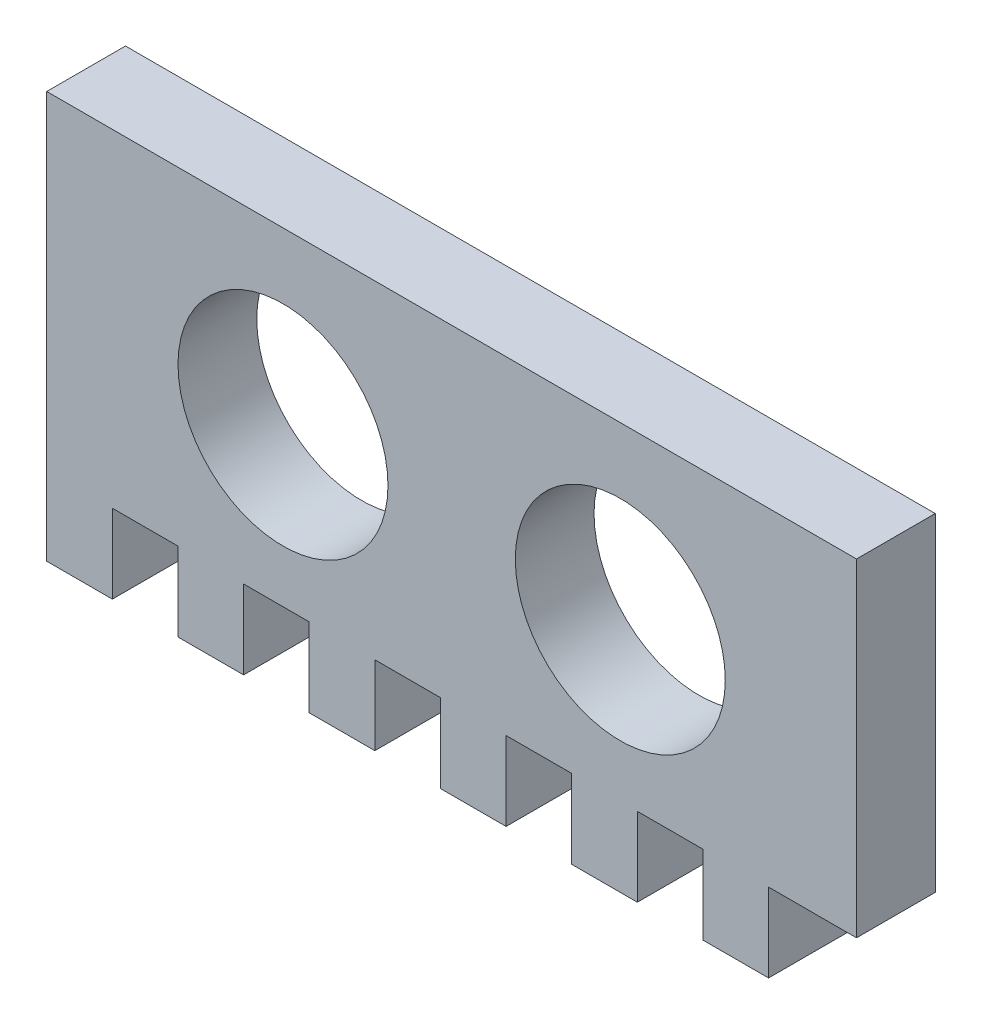
ISO-10303-21;
HEADER;
FILE_DESCRIPTION(('STEP AP214'),'2;1');
FILE_NAME('part.step','',(''),(''),'','','');
FILE_SCHEMA(('AUTOMOTIVE_DESIGN { 1 0 10303 214 1 1 1 1 }'));
ENDSEC;
DATA;
#1=APPLICATION_CONTEXT('core data for automotive mechanical design processes');
#2=APPLICATION_PROTOCOL_DEFINITION('international standard','automotive_design',2000,#1);
#3=PRODUCT_CONTEXT('',#1,'mechanical');
#4=PRODUCT('Part','Part','',(#3));
#5=PRODUCT_RELATED_PRODUCT_CATEGORY('part','',(#4));
#6=PRODUCT_DEFINITION_FORMATION('','',#4);
#7=PRODUCT_DEFINITION_CONTEXT('part definition',#1,'design');
#8=PRODUCT_DEFINITION('design','',#6,#7);
#9=PRODUCT_DEFINITION_SHAPE('','',#8);
#10=(LENGTH_UNIT() NAMED_UNIT(*) SI_UNIT(.MILLI.,.METRE.));
#11=(NAMED_UNIT(*) PLANE_ANGLE_UNIT() SI_UNIT($,.RADIAN.));
#12=(NAMED_UNIT(*) SI_UNIT($,.STERADIAN.) SOLID_ANGLE_UNIT());
#13=UNCERTAINTY_MEASURE_WITH_UNIT(LENGTH_MEASURE(1.E-05),#10,'distance_accuracy_value','');
#14=(GEOMETRIC_REPRESENTATION_CONTEXT(3) GLOBAL_UNCERTAINTY_ASSIGNED_CONTEXT((#13)) GLOBAL_UNIT_ASSIGNED_CONTEXT((#10,
#11,#12)) REPRESENTATION_CONTEXT('',''));
#15=CARTESIAN_POINT('',(0.,0.,0.));
#16=DIRECTION('',(0.,0.,1.));
#17=DIRECTION('',(1.,0.,0.));
#18=AXIS2_PLACEMENT_3D('',#15,#16,#17);
#19=CARTESIAN_POINT('',(0.,0.,6.));
#20=DIRECTION('',(0.,0.,1.));
#21=DIRECTION('',(1.,0.,0.));
#22=AXIS2_PLACEMENT_3D('',#19,#20,#21);
#23=PLANE('',#22);
#24=CARTESIAN_POINT('',(18.,18.,6.));
#25=DIRECTION('',(0.,0.,1.));
#26=DIRECTION('',(1.,0.,0.));
#27=AXIS2_PLACEMENT_3D('',#24,#25,#26);
#28=CIRCLE('',#27,8.);
#29=CARTESIAN_POINT('',(26.,18.,6.));
#30=VERTEX_POINT('',#29);
#31=EDGE_CURVE('E370',#30,#30,#28,.T.);
#32=ORIENTED_EDGE('',*,*,#31,.F.);
#33=EDGE_LOOP('',(#32));
#34=FACE_BOUND('',#33,.T.);
#35=DIRECTION('',(1.,0.,0.));
#36=VECTOR('',#35,1.);
#37=CARTESIAN_POINT('',(0.,0.,6.));
#38=LINE('',#37,#36);
#39=CARTESIAN_POINT('',(0.,0.,6.));
#40=VERTEX_POINT('',#39);
#41=CARTESIAN_POINT('',(5.,0.,6.));
#42=VERTEX_POINT('',#41);
#43=EDGE_CURVE('E363',#40,#42,#38,.T.);
#44=ORIENTED_EDGE('',*,*,#43,.T.);
#45=DIRECTION('',(0.,1.,0.));
#46=VECTOR('',#45,1.);
#47=CARTESIAN_POINT('',(5.,0.,6.));
#48=LINE('',#47,#46);
#49=CARTESIAN_POINT('',(5.,6.,6.));
#50=VERTEX_POINT('',#49);
#51=EDGE_CURVE('E159',#42,#50,#48,.T.);
#52=ORIENTED_EDGE('',*,*,#51,.T.);
#53=DIRECTION('',(1.,0.,0.));
#54=VECTOR('',#53,1.);
#55=CARTESIAN_POINT('',(5.,6.,6.));
#56=LINE('',#55,#54);
#57=CARTESIAN_POINT('',(10.,6.,6.));
#58=VERTEX_POINT('',#57);
#59=EDGE_CURVE('E357',#50,#58,#56,.T.);
#60=ORIENTED_EDGE('',*,*,#59,.T.);
#61=DIRECTION('',(0.,-1.,0.));
#62=VECTOR('',#61,1.);
#63=CARTESIAN_POINT('',(10.,6.,6.));
#64=LINE('',#63,#62);
#65=CARTESIAN_POINT('',(10.,0.,6.));
#66=VERTEX_POINT('',#65);
#67=EDGE_CURVE('E349',#58,#66,#64,.T.);
#68=ORIENTED_EDGE('',*,*,#67,.T.);
#69=DIRECTION('',(1.,0.,0.));
#70=VECTOR('',#69,1.);
#71=CARTESIAN_POINT('',(10.,0.,6.));
#72=LINE('',#71,#70);
#73=CARTESIAN_POINT('',(15.,0.,6.));
#74=VERTEX_POINT('',#73);
#75=EDGE_CURVE('E345',#66,#74,#72,.T.);
#76=ORIENTED_EDGE('',*,*,#75,.T.);
#77=DIRECTION('',(0.,1.,0.));
#78=VECTOR('',#77,1.);
#79=CARTESIAN_POINT('',(15.,0.,6.));
#80=LINE('',#79,#78);
#81=CARTESIAN_POINT('',(15.,6.,6.));
#82=VERTEX_POINT('',#81);
#83=EDGE_CURVE('E341',#74,#82,#80,.T.);
#84=ORIENTED_EDGE('',*,*,#83,.T.);
#85=DIRECTION('',(1.,0.,0.));
#86=VECTOR('',#85,1.);
#87=CARTESIAN_POINT('',(15.,6.,6.));
#88=LINE('',#87,#86);
#89=CARTESIAN_POINT('',(20.,6.,6.));
#90=VERTEX_POINT('',#89);
#91=EDGE_CURVE('E338',#82,#90,#88,.T.);
#92=ORIENTED_EDGE('',*,*,#91,.T.);
#93=DIRECTION('',(0.,-1.,0.));
#94=VECTOR('',#93,1.);
#95=CARTESIAN_POINT('',(20.,6.,6.));
#96=LINE('',#95,#94);
#97=CARTESIAN_POINT('',(20.,0.,6.));
#98=VERTEX_POINT('',#97);
#99=EDGE_CURVE('E330',#90,#98,#96,.T.);
#100=ORIENTED_EDGE('',*,*,#99,.T.);
#101=DIRECTION('',(1.,0.,0.));
#102=VECTOR('',#101,1.);
#103=CARTESIAN_POINT('',(20.,0.,6.));
#104=LINE('',#103,#102);
#105=CARTESIAN_POINT('',(25.,0.,6.));
#106=VERTEX_POINT('',#105);
#107=EDGE_CURVE('E326',#98,#106,#104,.T.);
#108=ORIENTED_EDGE('',*,*,#107,.T.);
#109=DIRECTION('',(0.,1.,0.));
#110=VECTOR('',#109,1.);
#111=CARTESIAN_POINT('',(25.,0.,6.));
#112=LINE('',#111,#110);
#113=CARTESIAN_POINT('',(25.,6.,6.));
#114=VERTEX_POINT('',#113);
#115=EDGE_CURVE('E322',#106,#114,#112,.T.);
#116=ORIENTED_EDGE('',*,*,#115,.T.);
#117=DIRECTION('',(1.,0.,0.));
#118=VECTOR('',#117,1.);
#119=CARTESIAN_POINT('',(25.,6.,6.));
#120=LINE('',#119,#118);
#121=CARTESIAN_POINT('',(30.,6.,6.));
#122=VERTEX_POINT('',#121);
#123=EDGE_CURVE('E319',#114,#122,#120,.T.);
#124=ORIENTED_EDGE('',*,*,#123,.T.);
#125=DIRECTION('',(0.,-1.,0.));
#126=VECTOR('',#125,1.);
#127=CARTESIAN_POINT('',(30.,6.,6.));
#128=LINE('',#127,#126);
#129=CARTESIAN_POINT('',(30.,0.,6.));
#130=VERTEX_POINT('',#129);
#131=EDGE_CURVE('E311',#122,#130,#128,.T.);
#132=ORIENTED_EDGE('',*,*,#131,.T.);
#133=DIRECTION('',(1.,0.,0.));
#134=VECTOR('',#133,1.);
#135=CARTESIAN_POINT('',(30.,0.,6.));
#136=LINE('',#135,#134);
#137=CARTESIAN_POINT('',(35.,0.,6.));
#138=VERTEX_POINT('',#137);
#139=EDGE_CURVE('E307',#130,#138,#136,.T.);
#140=ORIENTED_EDGE('',*,*,#139,.T.);
#141=DIRECTION('',(0.,1.,0.));
#142=VECTOR('',#141,1.);
#143=CARTESIAN_POINT('',(35.,0.,6.));
#144=LINE('',#143,#142);
#145=CARTESIAN_POINT('',(35.,6.,6.));
#146=VERTEX_POINT('',#145);
#147=EDGE_CURVE('E303',#138,#146,#144,.T.);
#148=ORIENTED_EDGE('',*,*,#147,.T.);
#149=DIRECTION('',(1.,0.,0.));
#150=VECTOR('',#149,1.);
#151=CARTESIAN_POINT('',(35.,6.,6.));
#152=LINE('',#151,#150);
#153=CARTESIAN_POINT('',(40.,6.,6.));
#154=VERTEX_POINT('',#153);
#155=EDGE_CURVE('E300',#146,#154,#152,.T.);
#156=ORIENTED_EDGE('',*,*,#155,.T.);
#157=DIRECTION('',(0.,-1.,0.));
#158=VECTOR('',#157,1.);
#159=CARTESIAN_POINT('',(40.,6.,6.));
#160=LINE('',#159,#158);
#161=CARTESIAN_POINT('',(40.,0.,6.));
#162=VERTEX_POINT('',#161);
#163=EDGE_CURVE('E292',#154,#162,#160,.T.);
#164=ORIENTED_EDGE('',*,*,#163,.T.);
#165=DIRECTION('',(1.,0.,0.));
#166=VECTOR('',#165,1.);
#167=CARTESIAN_POINT('',(40.,0.,6.));
#168=LINE('',#167,#166);
#169=CARTESIAN_POINT('',(45.,0.,6.));
#170=VERTEX_POINT('',#169);
#171=EDGE_CURVE('E288',#162,#170,#168,.T.);
#172=ORIENTED_EDGE('',*,*,#171,.T.);
#173=DIRECTION('',(0.,1.,0.));
#174=VECTOR('',#173,1.);
#175=CARTESIAN_POINT('',(45.,0.,6.));
#176=LINE('',#175,#174);
#177=CARTESIAN_POINT('',(45.,6.,6.));
#178=VERTEX_POINT('',#177);
#179=EDGE_CURVE('E284',#170,#178,#176,.T.);
#180=ORIENTED_EDGE('',*,*,#179,.T.);
#181=DIRECTION('',(1.,0.,0.));
#182=VECTOR('',#181,1.);
#183=CARTESIAN_POINT('',(45.,6.,6.));
#184=LINE('',#183,#182);
#185=CARTESIAN_POINT('',(50.,6.,6.));
#186=VERTEX_POINT('',#185);
#187=EDGE_CURVE('E281',#178,#186,#184,.T.);
#188=ORIENTED_EDGE('',*,*,#187,.T.);
#189=DIRECTION('',(0.,-1.,0.));
#190=VECTOR('',#189,1.);
#191=CARTESIAN_POINT('',(50.,6.,6.));
#192=LINE('',#191,#190);
#193=CARTESIAN_POINT('',(50.,0.,6.));
#194=VERTEX_POINT('',#193);
#195=EDGE_CURVE('E273',#186,#194,#192,.T.);
#196=ORIENTED_EDGE('',*,*,#195,.T.);
#197=DIRECTION('',(1.,0.,0.));
#198=VECTOR('',#197,1.);
#199=CARTESIAN_POINT('',(50.,0.,6.));
#200=LINE('',#199,#198);
#201=CARTESIAN_POINT('',(55.,0.,6.));
#202=VERTEX_POINT('',#201);
#203=EDGE_CURVE('E269',#194,#202,#200,.T.);
#204=ORIENTED_EDGE('',*,*,#203,.T.);
#205=DIRECTION('',(0.,1.,0.));
#206=VECTOR('',#205,1.);
#207=CARTESIAN_POINT('',(55.,0.,6.));
#208=LINE('',#207,#206);
#209=CARTESIAN_POINT('',(55.,6.,6.));
#210=VERTEX_POINT('',#209);
#211=EDGE_CURVE('E265',#202,#210,#208,.T.);
#212=ORIENTED_EDGE('',*,*,#211,.T.);
#213=DIRECTION('',(1.,0.,0.));
#214=VECTOR('',#213,1.);
#215=CARTESIAN_POINT('',(55.,6.,6.));
#216=LINE('',#215,#214);
#217=CARTESIAN_POINT('',(61.7,6.,6.));
#218=VERTEX_POINT('',#217);
#219=EDGE_CURVE('E232',#210,#218,#216,.T.);
#220=ORIENTED_EDGE('',*,*,#219,.T.);
#221=DIRECTION('',(0.,1.,0.));
#222=VECTOR('',#221,1.);
#223=CARTESIAN_POINT('',(61.7,31.,6.));
#224=LINE('',#223,#222);
#225=CARTESIAN_POINT('',(61.7,31.,6.));
#226=VERTEX_POINT('',#225);
#227=EDGE_CURVE('E226',#218,#226,#224,.T.);
#228=ORIENTED_EDGE('',*,*,#227,.T.);
#229=DIRECTION('',(-1.,0.,0.));
#230=VECTOR('',#229,1.);
#231=CARTESIAN_POINT('',(0.,31.,6.));
#232=LINE('',#231,#230);
#233=CARTESIAN_POINT('',(0.,31.,6.));
#234=VERTEX_POINT('',#233);
#235=EDGE_CURVE('E230',#226,#234,#232,.T.);
#236=ORIENTED_EDGE('',*,*,#235,.T.);
#237=DIRECTION('',(0.,-1.,0.));
#238=VECTOR('',#237,1.);
#239=CARTESIAN_POINT('',(0.,0.,6.));
#240=LINE('',#239,#238);
#241=EDGE_CURVE('E62',#234,#40,#240,.T.);
#242=ORIENTED_EDGE('',*,*,#241,.T.);
#243=EDGE_LOOP('',(#44,#52,#60,#68,#76,#84,#92,#100,#108,#116,#124,#132,#140,#148,#156,#164,
#172,#180,#188,#196,#204,#212,#220,#228,#236,#242));
#244=FACE_BOUND('',#243,.T.);
#245=CARTESIAN_POINT('',(43.7,18.,6.));
#246=DIRECTION('',(0.,0.,1.));
#247=DIRECTION('',(1.,0.,0.));
#248=AXIS2_PLACEMENT_3D('',#245,#246,#247);
#249=CIRCLE('',#248,8.);
#250=CARTESIAN_POINT('',(51.7,18.,6.));
#251=VERTEX_POINT('',#250);
#252=EDGE_CURVE('E379',#251,#251,#249,.T.);
#253=ORIENTED_EDGE('',*,*,#252,.F.);
#254=EDGE_LOOP('',(#253));
#255=FACE_BOUND('',#254,.T.);
#256=ADVANCED_FACE('F44',(#34,#244,#255),#23,.T.);
#257=CARTESIAN_POINT('',(0.,0.,0.));
#258=DIRECTION('',(0.,0.,1.));
#259=DIRECTION('',(1.,0.,0.));
#260=AXIS2_PLACEMENT_3D('',#257,#258,#259);
#261=PLANE('',#260);
#262=DIRECTION('',(1.,0.,0.));
#263=VECTOR('',#262,1.);
#264=CARTESIAN_POINT('',(0.,0.,0.));
#265=LINE('',#264,#263);
#266=CARTESIAN_POINT('',(0.,0.,0.));
#267=VERTEX_POINT('',#266);
#268=CARTESIAN_POINT('',(5.,0.,0.));
#269=VERTEX_POINT('',#268);
#270=EDGE_CURVE('E375',#267,#269,#265,.T.);
#271=ORIENTED_EDGE('',*,*,#270,.F.);
#272=DIRECTION('',(0.,-1.,0.));
#273=VECTOR('',#272,1.);
#274=CARTESIAN_POINT('',(0.,0.,0.));
#275=LINE('',#274,#273);
#276=CARTESIAN_POINT('',(0.,31.,0.));
#277=VERTEX_POINT('',#276);
#278=EDGE_CURVE('E151',#277,#267,#275,.T.);
#279=ORIENTED_EDGE('',*,*,#278,.F.);
#280=DIRECTION('',(-1.,0.,0.));
#281=VECTOR('',#280,1.);
#282=CARTESIAN_POINT('',(0.,31.,0.));
#283=LINE('',#282,#281);
#284=CARTESIAN_POINT('',(61.7,31.,0.));
#285=VERTEX_POINT('',#284);
#286=EDGE_CURVE('E145',#285,#277,#283,.T.);
#287=ORIENTED_EDGE('',*,*,#286,.F.);
#288=DIRECTION('',(0.,1.,0.));
#289=VECTOR('',#288,1.);
#290=CARTESIAN_POINT('',(61.7,31.,0.));
#291=LINE('',#290,#289);
#292=CARTESIAN_POINT('',(61.7,6.,0.));
#293=VERTEX_POINT('',#292);
#294=EDGE_CURVE('E241',#293,#285,#291,.T.);
#295=ORIENTED_EDGE('',*,*,#294,.F.);
#296=DIRECTION('',(1.,0.,0.));
#297=VECTOR('',#296,1.);
#298=CARTESIAN_POINT('',(55.,6.,0.));
#299=LINE('',#298,#297);
#300=CARTESIAN_POINT('',(55.,6.,0.));
#301=VERTEX_POINT('',#300);
#302=EDGE_CURVE('E583',#301,#293,#299,.T.);
#303=ORIENTED_EDGE('',*,*,#302,.F.);
#304=DIRECTION('',(0.,1.,0.));
#305=VECTOR('',#304,1.);
#306=CARTESIAN_POINT('',(55.,0.,0.));
#307=LINE('',#306,#305);
#308=CARTESIAN_POINT('',(55.,0.,0.));
#309=VERTEX_POINT('',#308);
#310=EDGE_CURVE('E580',#309,#301,#307,.T.);
#311=ORIENTED_EDGE('',*,*,#310,.F.);
#312=DIRECTION('',(1.,0.,0.));
#313=VECTOR('',#312,1.);
#314=CARTESIAN_POINT('',(50.,0.,0.));
#315=LINE('',#314,#313);
#316=CARTESIAN_POINT('',(50.,0.,0.));
#317=VERTEX_POINT('',#316);
#318=EDGE_CURVE('E577',#317,#309,#315,.T.);
#319=ORIENTED_EDGE('',*,*,#318,.F.);
#320=DIRECTION('',(0.,-1.,0.));
#321=VECTOR('',#320,1.);
#322=CARTESIAN_POINT('',(50.,6.,0.));
#323=LINE('',#322,#321);
#324=CARTESIAN_POINT('',(50.,6.,0.));
#325=VERTEX_POINT('',#324);
#326=EDGE_CURVE('E574',#325,#317,#323,.T.);
#327=ORIENTED_EDGE('',*,*,#326,.F.);
#328=DIRECTION('',(1.,0.,0.));
#329=VECTOR('',#328,1.);
#330=CARTESIAN_POINT('',(45.,6.,0.));
#331=LINE('',#330,#329);
#332=CARTESIAN_POINT('',(45.,6.,0.));
#333=VERTEX_POINT('',#332);
#334=EDGE_CURVE('E571',#333,#325,#331,.T.);
#335=ORIENTED_EDGE('',*,*,#334,.F.);
#336=DIRECTION('',(0.,1.,0.));
#337=VECTOR('',#336,1.);
#338=CARTESIAN_POINT('',(45.,0.,0.));
#339=LINE('',#338,#337);
#340=CARTESIAN_POINT('',(45.,0.,0.));
#341=VERTEX_POINT('',#340);
#342=EDGE_CURVE('E568',#341,#333,#339,.T.);
#343=ORIENTED_EDGE('',*,*,#342,.F.);
#344=DIRECTION('',(1.,0.,0.));
#345=VECTOR('',#344,1.);
#346=CARTESIAN_POINT('',(40.,0.,0.));
#347=LINE('',#346,#345);
#348=CARTESIAN_POINT('',(40.,0.,0.));
#349=VERTEX_POINT('',#348);
#350=EDGE_CURVE('E565',#349,#341,#347,.T.);
#351=ORIENTED_EDGE('',*,*,#350,.F.);
#352=DIRECTION('',(0.,-1.,0.));
#353=VECTOR('',#352,1.);
#354=CARTESIAN_POINT('',(40.,6.,0.));
#355=LINE('',#354,#353);
#356=CARTESIAN_POINT('',(40.,6.,0.));
#357=VERTEX_POINT('',#356);
#358=EDGE_CURVE('E562',#357,#349,#355,.T.);
#359=ORIENTED_EDGE('',*,*,#358,.F.);
#360=DIRECTION('',(1.,0.,0.));
#361=VECTOR('',#360,1.);
#362=CARTESIAN_POINT('',(35.,6.,0.));
#363=LINE('',#362,#361);
#364=CARTESIAN_POINT('',(35.,6.,0.));
#365=VERTEX_POINT('',#364);
#366=EDGE_CURVE('E559',#365,#357,#363,.T.);
#367=ORIENTED_EDGE('',*,*,#366,.F.);
#368=DIRECTION('',(0.,1.,0.));
#369=VECTOR('',#368,1.);
#370=CARTESIAN_POINT('',(35.,0.,0.));
#371=LINE('',#370,#369);
#372=CARTESIAN_POINT('',(35.,0.,0.));
#373=VERTEX_POINT('',#372);
#374=EDGE_CURVE('E556',#373,#365,#371,.T.);
#375=ORIENTED_EDGE('',*,*,#374,.F.);
#376=DIRECTION('',(1.,0.,0.));
#377=VECTOR('',#376,1.);
#378=CARTESIAN_POINT('',(30.,0.,0.));
#379=LINE('',#378,#377);
#380=CARTESIAN_POINT('',(30.,0.,0.));
#381=VERTEX_POINT('',#380);
#382=EDGE_CURVE('E553',#381,#373,#379,.T.);
#383=ORIENTED_EDGE('',*,*,#382,.F.);
#384=DIRECTION('',(0.,-1.,0.));
#385=VECTOR('',#384,1.);
#386=CARTESIAN_POINT('',(30.,6.,0.));
#387=LINE('',#386,#385);
#388=CARTESIAN_POINT('',(30.,6.,0.));
#389=VERTEX_POINT('',#388);
#390=EDGE_CURVE('E550',#389,#381,#387,.T.);
#391=ORIENTED_EDGE('',*,*,#390,.F.);
#392=DIRECTION('',(1.,0.,0.));
#393=VECTOR('',#392,1.);
#394=CARTESIAN_POINT('',(25.,6.,0.));
#395=LINE('',#394,#393);
#396=CARTESIAN_POINT('',(25.,6.,0.));
#397=VERTEX_POINT('',#396);
#398=EDGE_CURVE('E547',#397,#389,#395,.T.);
#399=ORIENTED_EDGE('',*,*,#398,.F.);
#400=DIRECTION('',(0.,1.,0.));
#401=VECTOR('',#400,1.);
#402=CARTESIAN_POINT('',(25.,0.,0.));
#403=LINE('',#402,#401);
#404=CARTESIAN_POINT('',(25.,0.,0.));
#405=VERTEX_POINT('',#404);
#406=EDGE_CURVE('E544',#405,#397,#403,.T.);
#407=ORIENTED_EDGE('',*,*,#406,.F.);
#408=DIRECTION('',(1.,0.,0.));
#409=VECTOR('',#408,1.);
#410=CARTESIAN_POINT('',(20.,0.,0.));
#411=LINE('',#410,#409);
#412=CARTESIAN_POINT('',(20.,0.,0.));
#413=VERTEX_POINT('',#412);
#414=EDGE_CURVE('E541',#413,#405,#411,.T.);
#415=ORIENTED_EDGE('',*,*,#414,.F.);
#416=DIRECTION('',(0.,-1.,0.));
#417=VECTOR('',#416,1.);
#418=CARTESIAN_POINT('',(20.,6.,0.));
#419=LINE('',#418,#417);
#420=CARTESIAN_POINT('',(20.,6.,0.));
#421=VERTEX_POINT('',#420);
#422=EDGE_CURVE('E538',#421,#413,#419,.T.);
#423=ORIENTED_EDGE('',*,*,#422,.F.);
#424=DIRECTION('',(1.,0.,0.));
#425=VECTOR('',#424,1.);
#426=CARTESIAN_POINT('',(15.,6.,0.));
#427=LINE('',#426,#425);
#428=CARTESIAN_POINT('',(15.,6.,0.));
#429=VERTEX_POINT('',#428);
#430=EDGE_CURVE('E535',#429,#421,#427,.T.);
#431=ORIENTED_EDGE('',*,*,#430,.F.);
#432=DIRECTION('',(0.,1.,0.));
#433=VECTOR('',#432,1.);
#434=CARTESIAN_POINT('',(15.,0.,0.));
#435=LINE('',#434,#433);
#436=CARTESIAN_POINT('',(15.,0.,0.));
#437=VERTEX_POINT('',#436);
#438=EDGE_CURVE('E532',#437,#429,#435,.T.);
#439=ORIENTED_EDGE('',*,*,#438,.F.);
#440=DIRECTION('',(1.,0.,0.));
#441=VECTOR('',#440,1.);
#442=CARTESIAN_POINT('',(10.,0.,0.));
#443=LINE('',#442,#441);
#444=CARTESIAN_POINT('',(10.,0.,0.));
#445=VERTEX_POINT('',#444);
#446=EDGE_CURVE('E527',#445,#437,#443,.T.);
#447=ORIENTED_EDGE('',*,*,#446,.F.);
#448=DIRECTION('',(0.,-1.,0.));
#449=VECTOR('',#448,1.);
#450=CARTESIAN_POINT('',(10.,6.,0.));
#451=LINE('',#450,#449);
#452=CARTESIAN_POINT('',(10.,6.,0.));
#453=VERTEX_POINT('',#452);
#454=EDGE_CURVE('E523',#453,#445,#451,.T.);
#455=ORIENTED_EDGE('',*,*,#454,.F.);
#456=DIRECTION('',(1.,0.,0.));
#457=VECTOR('',#456,1.);
#458=CARTESIAN_POINT('',(5.,6.,0.));
#459=LINE('',#458,#457);
#460=CARTESIAN_POINT('',(5.,6.,0.));
#461=VERTEX_POINT('',#460);
#462=EDGE_CURVE('E515',#461,#453,#459,.T.);
#463=ORIENTED_EDGE('',*,*,#462,.F.);
#464=DIRECTION('',(0.,1.,0.));
#465=VECTOR('',#464,1.);
#466=CARTESIAN_POINT('',(5.,0.,0.));
#467=LINE('',#466,#465);
#468=EDGE_CURVE('E507',#269,#461,#467,.T.);
#469=ORIENTED_EDGE('',*,*,#468,.F.);
#470=EDGE_LOOP('',(#271,#279,#287,#295,#303,#311,#319,#327,#335,#343,#351,#359,#367,#375,#383,
#391,#399,#407,#415,#423,#431,#439,#447,#455,#463,#469));
#471=FACE_BOUND('',#470,.T.);
#472=CARTESIAN_POINT('',(18.,18.,0.));
#473=DIRECTION('',(0.,0.,1.));
#474=DIRECTION('',(1.,0.,0.));
#475=AXIS2_PLACEMENT_3D('',#472,#473,#474);
#476=CIRCLE('',#475,8.);
#477=CARTESIAN_POINT('',(26.,18.,0.));
#478=VERTEX_POINT('',#477);
#479=EDGE_CURVE('E367',#478,#478,#476,.T.);
#480=ORIENTED_EDGE('',*,*,#479,.T.);
#481=EDGE_LOOP('',(#480));
#482=FACE_BOUND('',#481,.T.);
#483=CARTESIAN_POINT('',(43.7,18.,0.));
#484=DIRECTION('',(0.,0.,1.));
#485=DIRECTION('',(1.,0.,0.));
#486=AXIS2_PLACEMENT_3D('',#483,#484,#485);
#487=CIRCLE('',#486,8.);
#488=CARTESIAN_POINT('',(51.7,18.,0.));
#489=VERTEX_POINT('',#488);
#490=EDGE_CURVE('E376',#489,#489,#487,.T.);
#491=ORIENTED_EDGE('',*,*,#490,.T.);
#492=EDGE_LOOP('',(#491));
#493=FACE_BOUND('',#492,.T.);
#494=ADVANCED_FACE('F389',(#471,#482,#493),#261,.F.);
#495=CARTESIAN_POINT('',(0.,0.,6.));
#496=DIRECTION('',(0.,1.,0.));
#497=DIRECTION('',(0.,0.,1.));
#498=AXIS2_PLACEMENT_3D('',#495,#496,#497);
#499=PLANE('',#498);
#500=ORIENTED_EDGE('',*,*,#270,.T.);
#501=DIRECTION('',(0.,0.,-1.));
#502=VECTOR('',#501,1.);
#503=CARTESIAN_POINT('',(5.,0.,6.));
#504=LINE('',#503,#502);
#505=EDGE_CURVE('E12',#42,#269,#504,.T.);
#506=ORIENTED_EDGE('',*,*,#505,.F.);
#507=ORIENTED_EDGE('',*,*,#43,.F.);
#508=DIRECTION('',(0.,0.,-1.));
#509=VECTOR('',#508,1.);
#510=CARTESIAN_POINT('',(0.,0.,6.));
#511=LINE('',#510,#509);
#512=EDGE_CURVE('E250',#40,#267,#511,.T.);
#513=ORIENTED_EDGE('',*,*,#512,.T.);
#514=EDGE_LOOP('',(#500,#506,#507,#513));
#515=FACE_BOUND('',#514,.T.);
#516=ADVANCED_FACE('F46',(#515),#499,.F.);
#517=CARTESIAN_POINT('',(5.,0.,6.));
#518=DIRECTION('',(-1.,0.,0.));
#519=DIRECTION('',(0.,0.,1.));
#520=AXIS2_PLACEMENT_3D('',#517,#518,#519);
#521=PLANE('',#520);
#522=ORIENTED_EDGE('',*,*,#468,.T.);
#523=DIRECTION('',(0.,0.,-1.));
#524=VECTOR('',#523,1.);
#525=CARTESIAN_POINT('',(5.,6.,6.));
#526=LINE('',#525,#524);
#527=EDGE_CURVE('E54',#50,#461,#526,.T.);
#528=ORIENTED_EDGE('',*,*,#527,.F.);
#529=ORIENTED_EDGE('',*,*,#51,.F.);
#530=ORIENTED_EDGE('',*,*,#505,.T.);
#531=EDGE_LOOP('',(#522,#528,#529,#530));
#532=FACE_BOUND('',#531,.T.);
#533=ADVANCED_FACE('F500',(#532),#521,.F.);
#534=CARTESIAN_POINT('',(5.,6.,6.));
#535=DIRECTION('',(0.,1.,0.));
#536=DIRECTION('',(0.,0.,1.));
#537=AXIS2_PLACEMENT_3D('',#534,#535,#536);
#538=PLANE('',#537);
#539=ORIENTED_EDGE('',*,*,#462,.T.);
#540=DIRECTION('',(0.,0.,-1.));
#541=VECTOR('',#540,1.);
#542=CARTESIAN_POINT('',(10.,6.,6.));
#543=LINE('',#542,#541);
#544=EDGE_CURVE('E520',#58,#453,#543,.T.);
#545=ORIENTED_EDGE('',*,*,#544,.F.);
#546=ORIENTED_EDGE('',*,*,#59,.F.);
#547=ORIENTED_EDGE('',*,*,#527,.T.);
#548=EDGE_LOOP('',(#539,#545,#546,#547));
#549=FACE_BOUND('',#548,.T.);
#550=ADVANCED_FACE('F497',(#549),#538,.F.);
#551=CARTESIAN_POINT('',(10.,6.,6.));
#552=DIRECTION('',(1.,0.,0.));
#553=DIRECTION('',(0.,0.,-1.));
#554=AXIS2_PLACEMENT_3D('',#551,#552,#553);
#555=PLANE('',#554);
#556=ORIENTED_EDGE('',*,*,#454,.T.);
#557=DIRECTION('',(0.,0.,-1.));
#558=VECTOR('',#557,1.);
#559=CARTESIAN_POINT('',(10.,0.,6.));
#560=LINE('',#559,#558);
#561=EDGE_CURVE('E670',#66,#445,#560,.T.);
#562=ORIENTED_EDGE('',*,*,#561,.F.);
#563=ORIENTED_EDGE('',*,*,#67,.F.);
#564=ORIENTED_EDGE('',*,*,#544,.T.);
#565=EDGE_LOOP('',(#556,#562,#563,#564));
#566=FACE_BOUND('',#565,.T.);
#567=ADVANCED_FACE('F493',(#566),#555,.F.);
#568=CARTESIAN_POINT('',(10.,0.,6.));
#569=DIRECTION('',(0.,1.,0.));
#570=DIRECTION('',(0.,0.,1.));
#571=AXIS2_PLACEMENT_3D('',#568,#569,#570);
#572=PLANE('',#571);
#573=ORIENTED_EDGE('',*,*,#446,.T.);
#574=DIRECTION('',(0.,0.,-1.));
#575=VECTOR('',#574,1.);
#576=CARTESIAN_POINT('',(15.,0.,6.));
#577=LINE('',#576,#575);
#578=EDGE_CURVE('E666',#74,#437,#577,.T.);
#579=ORIENTED_EDGE('',*,*,#578,.F.);
#580=ORIENTED_EDGE('',*,*,#75,.F.);
#581=ORIENTED_EDGE('',*,*,#561,.T.);
#582=EDGE_LOOP('',(#573,#579,#580,#581));
#583=FACE_BOUND('',#582,.T.);
#584=ADVANCED_FACE('F489',(#583),#572,.F.);
#585=CARTESIAN_POINT('',(15.,0.,6.));
#586=DIRECTION('',(-1.,0.,0.));
#587=DIRECTION('',(0.,0.,1.));
#588=AXIS2_PLACEMENT_3D('',#585,#586,#587);
#589=PLANE('',#588);
#590=ORIENTED_EDGE('',*,*,#438,.T.);
#591=DIRECTION('',(0.,0.,-1.));
#592=VECTOR('',#591,1.);
#593=CARTESIAN_POINT('',(15.,6.,6.));
#594=LINE('',#593,#592);
#595=EDGE_CURVE('E662',#82,#429,#594,.T.);
#596=ORIENTED_EDGE('',*,*,#595,.F.);
#597=ORIENTED_EDGE('',*,*,#83,.F.);
#598=ORIENTED_EDGE('',*,*,#578,.T.);
#599=EDGE_LOOP('',(#590,#596,#597,#598));
#600=FACE_BOUND('',#599,.T.);
#601=ADVANCED_FACE('F485',(#600),#589,.F.);
#602=CARTESIAN_POINT('',(15.,6.,6.));
#603=DIRECTION('',(0.,1.,0.));
#604=DIRECTION('',(-1.,0.,0.));
#605=AXIS2_PLACEMENT_3D('',#602,#603,#604);
#606=PLANE('',#605);
#607=ORIENTED_EDGE('',*,*,#430,.T.);
#608=DIRECTION('',(0.,0.,-1.));
#609=VECTOR('',#608,1.);
#610=CARTESIAN_POINT('',(20.,6.,6.));
#611=LINE('',#610,#609);
#612=EDGE_CURVE('E658',#90,#421,#611,.T.);
#613=ORIENTED_EDGE('',*,*,#612,.F.);
#614=ORIENTED_EDGE('',*,*,#91,.F.);
#615=ORIENTED_EDGE('',*,*,#595,.T.);
#616=EDGE_LOOP('',(#607,#613,#614,#615));
#617=FACE_BOUND('',#616,.T.);
#618=ADVANCED_FACE('F481',(#617),#606,.F.);
#619=CARTESIAN_POINT('',(20.,6.,6.));
#620=DIRECTION('',(1.,0.,0.));
#621=DIRECTION('',(0.,0.,-1.));
#622=AXIS2_PLACEMENT_3D('',#619,#620,#621);
#623=PLANE('',#622);
#624=ORIENTED_EDGE('',*,*,#422,.T.);
#625=DIRECTION('',(0.,0.,-1.));
#626=VECTOR('',#625,1.);
#627=CARTESIAN_POINT('',(20.,0.,6.));
#628=LINE('',#627,#626);
#629=EDGE_CURVE('E654',#98,#413,#628,.T.);
#630=ORIENTED_EDGE('',*,*,#629,.F.);
#631=ORIENTED_EDGE('',*,*,#99,.F.);
#632=ORIENTED_EDGE('',*,*,#612,.T.);
#633=EDGE_LOOP('',(#624,#630,#631,#632));
#634=FACE_BOUND('',#633,.T.);
#635=ADVANCED_FACE('F477',(#634),#623,.F.);
#636=CARTESIAN_POINT('',(20.,0.,6.));
#637=DIRECTION('',(0.,1.,0.));
#638=DIRECTION('',(-1.,0.,0.));
#639=AXIS2_PLACEMENT_3D('',#636,#637,#638);
#640=PLANE('',#639);
#641=ORIENTED_EDGE('',*,*,#414,.T.);
#642=DIRECTION('',(0.,0.,-1.));
#643=VECTOR('',#642,1.);
#644=CARTESIAN_POINT('',(25.,0.,6.));
#645=LINE('',#644,#643);
#646=EDGE_CURVE('E650',#106,#405,#645,.T.);
#647=ORIENTED_EDGE('',*,*,#646,.F.);
#648=ORIENTED_EDGE('',*,*,#107,.F.);
#649=ORIENTED_EDGE('',*,*,#629,.T.);
#650=EDGE_LOOP('',(#641,#647,#648,#649));
#651=FACE_BOUND('',#650,.T.);
#652=ADVANCED_FACE('F473',(#651),#640,.F.);
#653=CARTESIAN_POINT('',(25.,0.,6.));
#654=DIRECTION('',(-1.,0.,0.));
#655=DIRECTION('',(0.,0.,1.));
#656=AXIS2_PLACEMENT_3D('',#653,#654,#655);
#657=PLANE('',#656);
#658=ORIENTED_EDGE('',*,*,#406,.T.);
#659=DIRECTION('',(0.,0.,-1.));
#660=VECTOR('',#659,1.);
#661=CARTESIAN_POINT('',(25.,6.,6.));
#662=LINE('',#661,#660);
#663=EDGE_CURVE('E646',#114,#397,#662,.T.);
#664=ORIENTED_EDGE('',*,*,#663,.F.);
#665=ORIENTED_EDGE('',*,*,#115,.F.);
#666=ORIENTED_EDGE('',*,*,#646,.T.);
#667=EDGE_LOOP('',(#658,#664,#665,#666));
#668=FACE_BOUND('',#667,.T.);
#669=ADVANCED_FACE('F469',(#668),#657,.F.);
#670=CARTESIAN_POINT('',(25.,6.,6.));
#671=DIRECTION('',(0.,1.,0.));
#672=DIRECTION('',(0.,0.,1.));
#673=AXIS2_PLACEMENT_3D('',#670,#671,#672);
#674=PLANE('',#673);
#675=ORIENTED_EDGE('',*,*,#398,.T.);
#676=DIRECTION('',(0.,0.,-1.));
#677=VECTOR('',#676,1.);
#678=CARTESIAN_POINT('',(30.,6.,6.));
#679=LINE('',#678,#677);
#680=EDGE_CURVE('E642',#122,#389,#679,.T.);
#681=ORIENTED_EDGE('',*,*,#680,.F.);
#682=ORIENTED_EDGE('',*,*,#123,.F.);
#683=ORIENTED_EDGE('',*,*,#663,.T.);
#684=EDGE_LOOP('',(#675,#681,#682,#683));
#685=FACE_BOUND('',#684,.T.);
#686=ADVANCED_FACE('F465',(#685),#674,.F.);
#687=CARTESIAN_POINT('',(30.,6.,6.));
#688=DIRECTION('',(1.,0.,0.));
#689=DIRECTION('',(0.,0.,-1.));
#690=AXIS2_PLACEMENT_3D('',#687,#688,#689);
#691=PLANE('',#690);
#692=ORIENTED_EDGE('',*,*,#390,.T.);
#693=DIRECTION('',(0.,0.,-1.));
#694=VECTOR('',#693,1.);
#695=CARTESIAN_POINT('',(30.,0.,6.));
#696=LINE('',#695,#694);
#697=EDGE_CURVE('E638',#130,#381,#696,.T.);
#698=ORIENTED_EDGE('',*,*,#697,.F.);
#699=ORIENTED_EDGE('',*,*,#131,.F.);
#700=ORIENTED_EDGE('',*,*,#680,.T.);
#701=EDGE_LOOP('',(#692,#698,#699,#700));
#702=FACE_BOUND('',#701,.T.);
#703=ADVANCED_FACE('F461',(#702),#691,.F.);
#704=CARTESIAN_POINT('',(30.,0.,6.));
#705=DIRECTION('',(0.,1.,0.));
#706=DIRECTION('',(-1.,0.,0.));
#707=AXIS2_PLACEMENT_3D('',#704,#705,#706);
#708=PLANE('',#707);
#709=ORIENTED_EDGE('',*,*,#382,.T.);
#710=DIRECTION('',(0.,0.,-1.));
#711=VECTOR('',#710,1.);
#712=CARTESIAN_POINT('',(35.,0.,6.));
#713=LINE('',#712,#711);
#714=EDGE_CURVE('E634',#138,#373,#713,.T.);
#715=ORIENTED_EDGE('',*,*,#714,.F.);
#716=ORIENTED_EDGE('',*,*,#139,.F.);
#717=ORIENTED_EDGE('',*,*,#697,.T.);
#718=EDGE_LOOP('',(#709,#715,#716,#717));
#719=FACE_BOUND('',#718,.T.);
#720=ADVANCED_FACE('F457',(#719),#708,.F.);
#721=CARTESIAN_POINT('',(35.,0.,6.));
#722=DIRECTION('',(-1.,0.,0.));
#723=DIRECTION('',(0.,0.,1.));
#724=AXIS2_PLACEMENT_3D('',#721,#722,#723);
#725=PLANE('',#724);
#726=ORIENTED_EDGE('',*,*,#374,.T.);
#727=DIRECTION('',(0.,0.,-1.));
#728=VECTOR('',#727,1.);
#729=CARTESIAN_POINT('',(35.,6.,6.));
#730=LINE('',#729,#728);
#731=EDGE_CURVE('E630',#146,#365,#730,.T.);
#732=ORIENTED_EDGE('',*,*,#731,.F.);
#733=ORIENTED_EDGE('',*,*,#147,.F.);
#734=ORIENTED_EDGE('',*,*,#714,.T.);
#735=EDGE_LOOP('',(#726,#732,#733,#734));
#736=FACE_BOUND('',#735,.T.);
#737=ADVANCED_FACE('F453',(#736),#725,.F.);
#738=CARTESIAN_POINT('',(35.,6.,6.));
#739=DIRECTION('',(0.,1.,0.));
#740=DIRECTION('',(0.,0.,1.));
#741=AXIS2_PLACEMENT_3D('',#738,#739,#740);
#742=PLANE('',#741);
#743=ORIENTED_EDGE('',*,*,#366,.T.);
#744=DIRECTION('',(0.,0.,-1.));
#745=VECTOR('',#744,1.);
#746=CARTESIAN_POINT('',(40.,6.,6.));
#747=LINE('',#746,#745);
#748=EDGE_CURVE('E626',#154,#357,#747,.T.);
#749=ORIENTED_EDGE('',*,*,#748,.F.);
#750=ORIENTED_EDGE('',*,*,#155,.F.);
#751=ORIENTED_EDGE('',*,*,#731,.T.);
#752=EDGE_LOOP('',(#743,#749,#750,#751));
#753=FACE_BOUND('',#752,.T.);
#754=ADVANCED_FACE('F449',(#753),#742,.F.);
#755=CARTESIAN_POINT('',(40.,6.,6.));
#756=DIRECTION('',(1.,0.,0.));
#757=DIRECTION('',(0.,0.,-1.));
#758=AXIS2_PLACEMENT_3D('',#755,#756,#757);
#759=PLANE('',#758);
#760=ORIENTED_EDGE('',*,*,#358,.T.);
#761=DIRECTION('',(0.,0.,-1.));
#762=VECTOR('',#761,1.);
#763=CARTESIAN_POINT('',(40.,0.,6.));
#764=LINE('',#763,#762);
#765=EDGE_CURVE('E622',#162,#349,#764,.T.);
#766=ORIENTED_EDGE('',*,*,#765,.F.);
#767=ORIENTED_EDGE('',*,*,#163,.F.);
#768=ORIENTED_EDGE('',*,*,#748,.T.);
#769=EDGE_LOOP('',(#760,#766,#767,#768));
#770=FACE_BOUND('',#769,.T.);
#771=ADVANCED_FACE('F445',(#770),#759,.F.);
#772=CARTESIAN_POINT('',(40.,0.,6.));
#773=DIRECTION('',(0.,1.,0.));
#774=DIRECTION('',(0.,0.,1.));
#775=AXIS2_PLACEMENT_3D('',#772,#773,#774);
#776=PLANE('',#775);
#777=ORIENTED_EDGE('',*,*,#350,.T.);
#778=DIRECTION('',(0.,0.,-1.));
#779=VECTOR('',#778,1.);
#780=CARTESIAN_POINT('',(45.,0.,6.));
#781=LINE('',#780,#779);
#782=EDGE_CURVE('E618',#170,#341,#781,.T.);
#783=ORIENTED_EDGE('',*,*,#782,.F.);
#784=ORIENTED_EDGE('',*,*,#171,.F.);
#785=ORIENTED_EDGE('',*,*,#765,.T.);
#786=EDGE_LOOP('',(#777,#783,#784,#785));
#787=FACE_BOUND('',#786,.T.);
#788=ADVANCED_FACE('F441',(#787),#776,.F.);
#789=CARTESIAN_POINT('',(45.,0.,6.));
#790=DIRECTION('',(-1.,0.,0.));
#791=DIRECTION('',(0.,0.,1.));
#792=AXIS2_PLACEMENT_3D('',#789,#790,#791);
#793=PLANE('',#792);
#794=ORIENTED_EDGE('',*,*,#342,.T.);
#795=DIRECTION('',(0.,0.,-1.));
#796=VECTOR('',#795,1.);
#797=CARTESIAN_POINT('',(45.,6.,6.));
#798=LINE('',#797,#796);
#799=EDGE_CURVE('E614',#178,#333,#798,.T.);
#800=ORIENTED_EDGE('',*,*,#799,.F.);
#801=ORIENTED_EDGE('',*,*,#179,.F.);
#802=ORIENTED_EDGE('',*,*,#782,.T.);
#803=EDGE_LOOP('',(#794,#800,#801,#802));
#804=FACE_BOUND('',#803,.T.);
#805=ADVANCED_FACE('F437',(#804),#793,.F.);
#806=CARTESIAN_POINT('',(45.,6.,6.));
#807=DIRECTION('',(0.,1.,0.));
#808=DIRECTION('',(0.,0.,1.));
#809=AXIS2_PLACEMENT_3D('',#806,#807,#808);
#810=PLANE('',#809);
#811=ORIENTED_EDGE('',*,*,#334,.T.);
#812=DIRECTION('',(0.,0.,-1.));
#813=VECTOR('',#812,1.);
#814=CARTESIAN_POINT('',(50.,6.,6.));
#815=LINE('',#814,#813);
#816=EDGE_CURVE('E610',#186,#325,#815,.T.);
#817=ORIENTED_EDGE('',*,*,#816,.F.);
#818=ORIENTED_EDGE('',*,*,#187,.F.);
#819=ORIENTED_EDGE('',*,*,#799,.T.);
#820=EDGE_LOOP('',(#811,#817,#818,#819));
#821=FACE_BOUND('',#820,.T.);
#822=ADVANCED_FACE('F433',(#821),#810,.F.);
#823=CARTESIAN_POINT('',(50.,6.,6.));
#824=DIRECTION('',(1.,0.,0.));
#825=DIRECTION('',(0.,0.,-1.));
#826=AXIS2_PLACEMENT_3D('',#823,#824,#825);
#827=PLANE('',#826);
#828=ORIENTED_EDGE('',*,*,#326,.T.);
#829=DIRECTION('',(0.,0.,-1.));
#830=VECTOR('',#829,1.);
#831=CARTESIAN_POINT('',(50.,0.,6.));
#832=LINE('',#831,#830);
#833=EDGE_CURVE('E606',#194,#317,#832,.T.);
#834=ORIENTED_EDGE('',*,*,#833,.F.);
#835=ORIENTED_EDGE('',*,*,#195,.F.);
#836=ORIENTED_EDGE('',*,*,#816,.T.);
#837=EDGE_LOOP('',(#828,#834,#835,#836));
#838=FACE_BOUND('',#837,.T.);
#839=ADVANCED_FACE('F429',(#838),#827,.F.);
#840=CARTESIAN_POINT('',(50.,0.,6.));
#841=DIRECTION('',(0.,1.,0.));
#842=DIRECTION('',(0.,0.,1.));
#843=AXIS2_PLACEMENT_3D('',#840,#841,#842);
#844=PLANE('',#843);
#845=ORIENTED_EDGE('',*,*,#318,.T.);
#846=DIRECTION('',(0.,0.,-1.));
#847=VECTOR('',#846,1.);
#848=CARTESIAN_POINT('',(55.,0.,6.));
#849=LINE('',#848,#847);
#850=EDGE_CURVE('E602',#202,#309,#849,.T.);
#851=ORIENTED_EDGE('',*,*,#850,.F.);
#852=ORIENTED_EDGE('',*,*,#203,.F.);
#853=ORIENTED_EDGE('',*,*,#833,.T.);
#854=EDGE_LOOP('',(#845,#851,#852,#853));
#855=FACE_BOUND('',#854,.T.);
#856=ADVANCED_FACE('F425',(#855),#844,.F.);
#857=CARTESIAN_POINT('',(55.,0.,6.));
#858=DIRECTION('',(-1.,0.,0.));
#859=DIRECTION('',(0.,0.,1.));
#860=AXIS2_PLACEMENT_3D('',#857,#858,#859);
#861=PLANE('',#860);
#862=ORIENTED_EDGE('',*,*,#310,.T.);
#863=DIRECTION('',(0.,0.,-1.));
#864=VECTOR('',#863,1.);
#865=CARTESIAN_POINT('',(55.,6.,6.));
#866=LINE('',#865,#864);
#867=EDGE_CURVE('E598',#210,#301,#866,.T.);
#868=ORIENTED_EDGE('',*,*,#867,.F.);
#869=ORIENTED_EDGE('',*,*,#211,.F.);
#870=ORIENTED_EDGE('',*,*,#850,.T.);
#871=EDGE_LOOP('',(#862,#868,#869,#870));
#872=FACE_BOUND('',#871,.T.);
#873=ADVANCED_FACE('F421',(#872),#861,.F.);
#874=CARTESIAN_POINT('',(55.,6.,6.));
#875=DIRECTION('',(0.,1.,0.));
#876=DIRECTION('',(0.,0.,1.));
#877=AXIS2_PLACEMENT_3D('',#874,#875,#876);
#878=PLANE('',#877);
#879=ORIENTED_EDGE('',*,*,#302,.T.);
#880=DIRECTION('',(0.,0.,-1.));
#881=VECTOR('',#880,1.);
#882=CARTESIAN_POINT('',(61.7,6.,6.));
#883=LINE('',#882,#881);
#884=EDGE_CURVE('E243',#218,#293,#883,.T.);
#885=ORIENTED_EDGE('',*,*,#884,.F.);
#886=ORIENTED_EDGE('',*,*,#219,.F.);
#887=ORIENTED_EDGE('',*,*,#867,.T.);
#888=EDGE_LOOP('',(#879,#885,#886,#887));
#889=FACE_BOUND('',#888,.T.);
#890=ADVANCED_FACE('F418',(#889),#878,.F.);
#891=CARTESIAN_POINT('',(61.7,31.,6.));
#892=DIRECTION('',(-1.,0.,0.));
#893=DIRECTION('',(0.,0.,1.));
#894=AXIS2_PLACEMENT_3D('',#891,#892,#893);
#895=PLANE('',#894);
#896=ORIENTED_EDGE('',*,*,#294,.T.);
#897=DIRECTION('',(0.,0.,-1.));
#898=VECTOR('',#897,1.);
#899=CARTESIAN_POINT('',(61.7,31.,6.));
#900=LINE('',#899,#898);
#901=EDGE_CURVE('E238',#226,#285,#900,.T.);
#902=ORIENTED_EDGE('',*,*,#901,.F.);
#903=ORIENTED_EDGE('',*,*,#227,.F.);
#904=ORIENTED_EDGE('',*,*,#884,.T.);
#905=EDGE_LOOP('',(#896,#902,#903,#904));
#906=FACE_BOUND('',#905,.T.);
#907=ADVANCED_FACE('F239',(#906),#895,.F.);
#908=CARTESIAN_POINT('',(0.,31.,6.));
#909=DIRECTION('',(0.,-1.,0.));
#910=DIRECTION('',(1.,0.,0.));
#911=AXIS2_PLACEMENT_3D('',#908,#909,#910);
#912=PLANE('',#911);
#913=ORIENTED_EDGE('',*,*,#286,.T.);
#914=DIRECTION('',(0.,0.,-1.));
#915=VECTOR('',#914,1.);
#916=CARTESIAN_POINT('',(0.,31.,6.));
#917=LINE('',#916,#915);
#918=EDGE_CURVE('E244',#234,#277,#917,.T.);
#919=ORIENTED_EDGE('',*,*,#918,.F.);
#920=ORIENTED_EDGE('',*,*,#235,.F.);
#921=ORIENTED_EDGE('',*,*,#901,.T.);
#922=EDGE_LOOP('',(#913,#919,#920,#921));
#923=FACE_BOUND('',#922,.T.);
#924=ADVANCED_FACE('F246',(#923),#912,.F.);
#925=CARTESIAN_POINT('',(0.,0.,6.));
#926=DIRECTION('',(1.,0.,0.));
#927=DIRECTION('',(0.,0.,-1.));
#928=AXIS2_PLACEMENT_3D('',#925,#926,#927);
#929=PLANE('',#928);
#930=ORIENTED_EDGE('',*,*,#278,.T.);
#931=ORIENTED_EDGE('',*,*,#512,.F.);
#932=ORIENTED_EDGE('',*,*,#241,.F.);
#933=ORIENTED_EDGE('',*,*,#918,.T.);
#934=EDGE_LOOP('',(#930,#931,#932,#933));
#935=FACE_BOUND('',#934,.T.);
#936=ADVANCED_FACE('F395',(#935),#929,.F.);
#937=CARTESIAN_POINT('',(18.,18.,6.));
#938=DIRECTION('',(0.,0.,-1.));
#939=DIRECTION('',(-1.,0.,0.));
#940=AXIS2_PLACEMENT_3D('',#937,#938,#939);
#941=CYLINDRICAL_SURFACE('',#940,8.);
#942=ORIENTED_EDGE('',*,*,#31,.T.);
#943=EDGE_LOOP('',(#942));
#944=FACE_BOUND('',#943,.T.);
#945=ORIENTED_EDGE('',*,*,#479,.F.);
#946=EDGE_LOOP('',(#945));
#947=FACE_BOUND('',#946,.T.);
#948=ADVANCED_FACE('F392',(#944,#947),#941,.F.);
#949=CARTESIAN_POINT('',(43.7,18.,6.));
#950=DIRECTION('',(0.,0.,-1.));
#951=DIRECTION('',(-1.,0.,0.));
#952=AXIS2_PLACEMENT_3D('',#949,#950,#951);
#953=CYLINDRICAL_SURFACE('',#952,8.);
#954=ORIENTED_EDGE('',*,*,#252,.T.);
#955=EDGE_LOOP('',(#954));
#956=FACE_BOUND('',#955,.T.);
#957=ORIENTED_EDGE('',*,*,#490,.F.);
#958=EDGE_LOOP('',(#957));
#959=FACE_BOUND('',#958,.T.);
#960=ADVANCED_FACE('F394',(#956,#959),#953,.F.);
#961=CLOSED_SHELL('',(#256,#494,#516,#533,#550,#567,#584,#601,#618,#635,#652,#669,#686,#703,
#720,#737,#754,#771,#788,#805,#822,#839,#856,#873,#890,#907,#924,#936,#948,#960));
#962=MANIFOLD_SOLID_BREP('B2',#961);
#963=ADVANCED_BREP_SHAPE_REPRESENTATION('',(#18,#962),#14);
#964=SHAPE_DEFINITION_REPRESENTATION(#9,#963);
ENDSEC;
END-ISO-10303-21;
